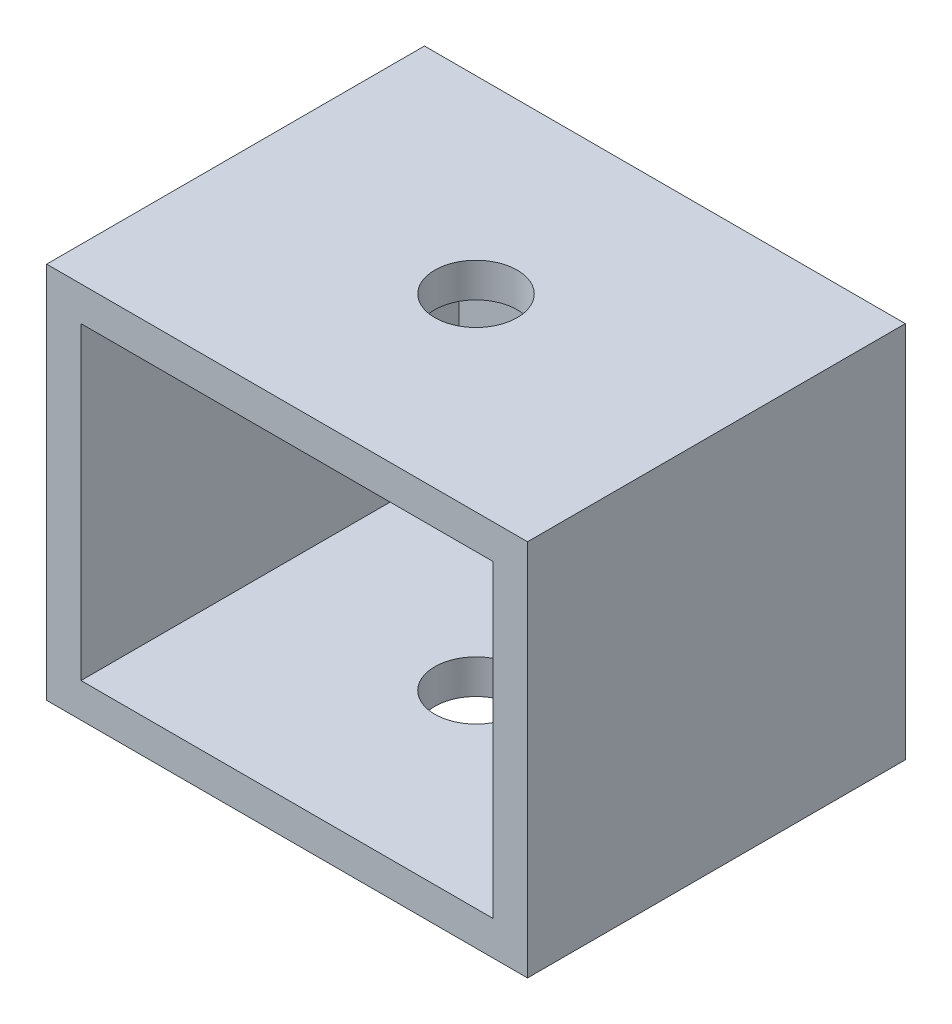
ISO-10303-21;
HEADER;
FILE_DESCRIPTION(('STEP AP214'),'2;1');
FILE_NAME('part.step','',(''),(''),'','','');
FILE_SCHEMA(('AUTOMOTIVE_DESIGN { 1 0 10303 214 1 1 1 1 }'));
ENDSEC;
DATA;
#1=APPLICATION_CONTEXT('core data for automotive mechanical design processes');
#2=APPLICATION_PROTOCOL_DEFINITION('international standard','automotive_design',2000,#1);
#3=PRODUCT_CONTEXT('',#1,'mechanical');
#4=PRODUCT('Part','Part','',(#3));
#5=PRODUCT_RELATED_PRODUCT_CATEGORY('part','',(#4));
#6=PRODUCT_DEFINITION_FORMATION('','',#4);
#7=PRODUCT_DEFINITION_CONTEXT('part definition',#1,'design');
#8=PRODUCT_DEFINITION('design','',#6,#7);
#9=PRODUCT_DEFINITION_SHAPE('','',#8);
#10=(LENGTH_UNIT() NAMED_UNIT(*) SI_UNIT(.MILLI.,.METRE.));
#11=(NAMED_UNIT(*) PLANE_ANGLE_UNIT() SI_UNIT($,.RADIAN.));
#12=(NAMED_UNIT(*) SI_UNIT($,.STERADIAN.) SOLID_ANGLE_UNIT());
#13=UNCERTAINTY_MEASURE_WITH_UNIT(LENGTH_MEASURE(1.E-05),#10,'distance_accuracy_value','');
#14=(GEOMETRIC_REPRESENTATION_CONTEXT(3) GLOBAL_UNCERTAINTY_ASSIGNED_CONTEXT((#13)) GLOBAL_UNIT_ASSIGNED_CONTEXT((#10,
#11,#12)) REPRESENTATION_CONTEXT('',''));
#15=CARTESIAN_POINT('',(0.,0.,0.));
#16=DIRECTION('',(0.,0.,1.));
#17=DIRECTION('',(1.,0.,0.));
#18=AXIS2_PLACEMENT_3D('',#15,#16,#17);
#19=CARTESIAN_POINT('',(-65.,50.,0.));
#20=DIRECTION('',(0.,1.,0.));
#21=DIRECTION('',(0.,0.,1.));
#22=AXIS2_PLACEMENT_3D('',#19,#20,#21);
#23=PLANE('',#22);
#24=CARTESIAN_POINT('',(-35.,50.,27.5));
#25=DIRECTION('',(0.,1.,0.));
#26=DIRECTION('',(0.,0.,1.));
#27=AXIS2_PLACEMENT_3D('',#24,#25,#26);
#28=CIRCLE('',#27,6.);
#29=CARTESIAN_POINT('',(-35.,50.,33.5));
#30=VERTEX_POINT('',#29);
#31=EDGE_CURVE('E177',#30,#30,#28,.T.);
#32=ORIENTED_EDGE('',*,*,#31,.T.);
#33=EDGE_LOOP('',(#32));
#34=FACE_BOUND('',#33,.T.);
#35=DIRECTION('',(0.,0.,1.));
#36=VECTOR('',#35,1.);
#37=CARTESIAN_POINT('',(-65.,50.,0.));
#38=LINE('',#37,#36);
#39=CARTESIAN_POINT('',(-65.,50.,5.));
#40=VERTEX_POINT('',#39);
#41=CARTESIAN_POINT('',(-65.,50.,55.));
#42=VERTEX_POINT('',#41);
#43=EDGE_CURVE('E144',#40,#42,#38,.T.);
#44=ORIENTED_EDGE('',*,*,#43,.F.);
#45=DIRECTION('',(-1.,0.,0.));
#46=VECTOR('',#45,1.);
#47=CARTESIAN_POINT('',(-5.,50.,5.));
#48=LINE('',#47,#46);
#49=CARTESIAN_POINT('',(-5.01959186529888,50.,5.));
#50=VERTEX_POINT('',#49);
#51=EDGE_CURVE('E11',#50,#40,#48,.T.);
#52=ORIENTED_EDGE('',*,*,#51,.F.);
#53=DIRECTION('',(0.,0.,1.));
#54=VECTOR('',#53,1.);
#55=CARTESIAN_POINT('',(-5.01959186529888,50.,0.));
#56=LINE('',#55,#54);
#57=CARTESIAN_POINT('',(-5.01959186529889,50.,0.));
#58=VERTEX_POINT('',#57);
#59=EDGE_CURVE('E141',#58,#50,#56,.T.);
#60=ORIENTED_EDGE('',*,*,#59,.F.);
#61=DIRECTION('',(-1.,0.,0.));
#62=VECTOR('',#61,1.);
#63=CARTESIAN_POINT('',(-10.0195918652989,50.,0.));
#64=LINE('',#63,#62);
#65=CARTESIAN_POINT('',(-5.,50.,0.));
#66=VERTEX_POINT('',#65);
#67=EDGE_CURVE('E235',#66,#58,#64,.T.);
#68=ORIENTED_EDGE('',*,*,#67,.F.);
#69=DIRECTION('',(0.,0.,1.));
#70=VECTOR('',#69,1.);
#71=CARTESIAN_POINT('',(-5.,50.,0.));
#72=LINE('',#71,#70);
#73=CARTESIAN_POINT('',(-5.,50.,55.));
#74=VERTEX_POINT('',#73);
#75=EDGE_CURVE('E220',#66,#74,#72,.T.);
#76=ORIENTED_EDGE('',*,*,#75,.T.);
#77=DIRECTION('',(-1.,0.,0.));
#78=VECTOR('',#77,1.);
#79=CARTESIAN_POINT('',(-5.,50.,55.));
#80=LINE('',#79,#78);
#81=EDGE_CURVE('E183',#74,#42,#80,.T.);
#82=ORIENTED_EDGE('',*,*,#81,.T.);
#83=EDGE_LOOP('',(#44,#52,#60,#68,#76,#82));
#84=FACE_BOUND('',#83,.T.);
#85=ADVANCED_FACE('F33',(#34,#84),#23,.F.);
#86=CARTESIAN_POINT('',(-65.,50.,0.));
#87=DIRECTION('',(-1.,0.,0.));
#88=DIRECTION('',(0.,0.,1.));
#89=AXIS2_PLACEMENT_3D('',#86,#87,#88);
#90=PLANE('',#89);
#91=DIRECTION('',(0.,0.,1.));
#92=VECTOR('',#91,1.);
#93=CARTESIAN_POINT('',(-65.,40.,0.));
#94=LINE('',#93,#92);
#95=CARTESIAN_POINT('',(-65.,40.,0.));
#96=VERTEX_POINT('',#95);
#97=CARTESIAN_POINT('',(-65.,40.,5.));
#98=VERTEX_POINT('',#97);
#99=EDGE_CURVE('E50',#96,#98,#94,.T.);
#100=ORIENTED_EDGE('',*,*,#99,.T.);
#101=DIRECTION('',(0.,1.,0.));
#102=VECTOR('',#101,1.);
#103=CARTESIAN_POINT('',(-65.,50.,5.));
#104=LINE('',#103,#102);
#105=EDGE_CURVE('E296',#98,#40,#104,.T.);
#106=ORIENTED_EDGE('',*,*,#105,.T.);
#107=ORIENTED_EDGE('',*,*,#43,.T.);
#108=DIRECTION('',(0.,-1.,0.));
#109=VECTOR('',#108,1.);
#110=CARTESIAN_POINT('',(-65.,5.,55.));
#111=LINE('',#110,#109);
#112=CARTESIAN_POINT('',(-65.,5.,55.));
#113=VERTEX_POINT('',#112);
#114=EDGE_CURVE('E185',#42,#113,#111,.T.);
#115=ORIENTED_EDGE('',*,*,#114,.T.);
#116=DIRECTION('',(0.,0.,1.));
#117=VECTOR('',#116,1.);
#118=CARTESIAN_POINT('',(-65.,5.,0.));
#119=LINE('',#118,#117);
#120=CARTESIAN_POINT('',(-65.,5.,0.));
#121=VERTEX_POINT('',#120);
#122=EDGE_CURVE('E218',#121,#113,#119,.T.);
#123=ORIENTED_EDGE('',*,*,#122,.F.);
#124=DIRECTION('',(0.,-1.,0.));
#125=VECTOR('',#124,1.);
#126=CARTESIAN_POINT('',(-65.,50.,0.));
#127=LINE('',#126,#125);
#128=EDGE_CURVE('E55',#96,#121,#127,.T.);
#129=ORIENTED_EDGE('',*,*,#128,.F.);
#130=EDGE_LOOP('',(#100,#106,#107,#115,#123,#129));
#131=FACE_BOUND('',#130,.T.);
#132=ADVANCED_FACE('F295',(#131),#90,.F.);
#133=CARTESIAN_POINT('',(-60.,50.,0.));
#134=DIRECTION('',(1.,0.,0.));
#135=DIRECTION('',(0.,1.,0.));
#136=AXIS2_PLACEMENT_3D('',#133,#134,#135);
#137=PLANE('',#136);
#138=DIRECTION('',(0.,0.,1.));
#139=VECTOR('',#138,1.);
#140=CARTESIAN_POINT('',(-60.,40.,0.));
#141=LINE('',#140,#139);
#142=CARTESIAN_POINT('',(-60.,40.,0.));
#143=VERTEX_POINT('',#142);
#144=CARTESIAN_POINT('',(-60.,40.,5.));
#145=VERTEX_POINT('',#144);
#146=EDGE_CURVE('E301',#143,#145,#141,.T.);
#147=ORIENTED_EDGE('',*,*,#146,.F.);
#148=DIRECTION('',(0.,1.,0.));
#149=VECTOR('',#148,1.);
#150=CARTESIAN_POINT('',(-60.,50.,0.));
#151=LINE('',#150,#149);
#152=CARTESIAN_POINT('',(-60.,5.,0.));
#153=VERTEX_POINT('',#152);
#154=EDGE_CURVE('E215',#153,#143,#151,.T.);
#155=ORIENTED_EDGE('',*,*,#154,.F.);
#156=DIRECTION('',(0.,0.,1.));
#157=VECTOR('',#156,1.);
#158=CARTESIAN_POINT('',(-60.,5.,0.));
#159=LINE('',#158,#157);
#160=CARTESIAN_POINT('',(-60.,5.,5.));
#161=VERTEX_POINT('',#160);
#162=EDGE_CURVE('E223',#153,#161,#159,.T.);
#163=ORIENTED_EDGE('',*,*,#162,.T.);
#164=DIRECTION('',(0.,1.,0.));
#165=VECTOR('',#164,1.);
#166=CARTESIAN_POINT('',(-60.,50.,5.));
#167=LINE('',#166,#165);
#168=EDGE_CURVE('E212',#161,#145,#167,.T.);
#169=ORIENTED_EDGE('',*,*,#168,.T.);
#170=EDGE_LOOP('',(#147,#155,#163,#169));
#171=FACE_BOUND('',#170,.T.);
#172=ADVANCED_FACE('F313',(#171),#137,.F.);
#173=CARTESIAN_POINT('',(-10.0195918652989,50.,0.));
#174=DIRECTION('',(-1.,0.,0.));
#175=DIRECTION('',(0.,-1.,0.));
#176=AXIS2_PLACEMENT_3D('',#173,#174,#175);
#177=PLANE('',#176);
#178=DIRECTION('',(0.,0.,-1.));
#179=VECTOR('',#178,1.);
#180=CARTESIAN_POINT('',(-10.0195918652989,40.,0.));
#181=LINE('',#180,#179);
#182=CARTESIAN_POINT('',(-10.0195918652989,40.,5.));
#183=VERTEX_POINT('',#182);
#184=CARTESIAN_POINT('',(-10.0195918652989,40.,0.));
#185=VERTEX_POINT('',#184);
#186=EDGE_CURVE('E167',#183,#185,#181,.T.);
#187=ORIENTED_EDGE('',*,*,#186,.F.);
#188=DIRECTION('',(0.,-1.,0.));
#189=VECTOR('',#188,1.);
#190=CARTESIAN_POINT('',(-10.0195918652989,50.,5.));
#191=LINE('',#190,#189);
#192=CARTESIAN_POINT('',(-10.0195918652989,5.,5.));
#193=VERTEX_POINT('',#192);
#194=EDGE_CURVE('E209',#183,#193,#191,.T.);
#195=ORIENTED_EDGE('',*,*,#194,.T.);
#196=DIRECTION('',(0.,0.,1.));
#197=VECTOR('',#196,1.);
#198=CARTESIAN_POINT('',(-10.0195918652989,5.,0.));
#199=LINE('',#198,#197);
#200=CARTESIAN_POINT('',(-10.0195918652989,5.,0.));
#201=VERTEX_POINT('',#200);
#202=EDGE_CURVE('E237',#201,#193,#199,.T.);
#203=ORIENTED_EDGE('',*,*,#202,.F.);
#204=DIRECTION('',(0.,-1.,0.));
#205=VECTOR('',#204,1.);
#206=CARTESIAN_POINT('',(-10.0195918652989,50.,0.));
#207=LINE('',#206,#205);
#208=EDGE_CURVE('E227',#185,#201,#207,.T.);
#209=ORIENTED_EDGE('',*,*,#208,.F.);
#210=EDGE_LOOP('',(#187,#195,#203,#209));
#211=FACE_BOUND('',#210,.T.);
#212=ADVANCED_FACE('F320',(#211),#177,.F.);
#213=CARTESIAN_POINT('',(0.,0.,5.));
#214=DIRECTION('',(0.,0.,1.));
#215=DIRECTION('',(1.,0.,0.));
#216=AXIS2_PLACEMENT_3D('',#213,#214,#215);
#217=PLANE('',#216);
#218=ORIENTED_EDGE('',*,*,#194,.F.);
#219=DIRECTION('',(-1.,0.,0.));
#220=VECTOR('',#219,1.);
#221=CARTESIAN_POINT('',(-5.01959186529888,40.,5.));
#222=LINE('',#221,#220);
#223=CARTESIAN_POINT('',(-5.01959186529888,40.,5.));
#224=VERTEX_POINT('',#223);
#225=EDGE_CURVE('E159',#224,#183,#222,.T.);
#226=ORIENTED_EDGE('',*,*,#225,.F.);
#227=DIRECTION('',(0.,-1.,0.));
#228=VECTOR('',#227,1.);
#229=CARTESIAN_POINT('',(-5.01959186529888,50.,5.));
#230=LINE('',#229,#228);
#231=EDGE_CURVE('E151',#50,#224,#230,.T.);
#232=ORIENTED_EDGE('',*,*,#231,.F.);
#233=ORIENTED_EDGE('',*,*,#51,.T.);
#234=ORIENTED_EDGE('',*,*,#105,.F.);
#235=DIRECTION('',(1.,0.,0.));
#236=VECTOR('',#235,1.);
#237=CARTESIAN_POINT('',(-65.,40.,5.));
#238=LINE('',#237,#236);
#239=EDGE_CURVE('E298',#98,#145,#238,.T.);
#240=ORIENTED_EDGE('',*,*,#239,.T.);
#241=ORIENTED_EDGE('',*,*,#168,.F.);
#242=DIRECTION('',(1.,0.,0.));
#243=VECTOR('',#242,1.);
#244=CARTESIAN_POINT('',(-65.,5.,5.));
#245=LINE('',#244,#243);
#246=EDGE_CURVE('E42',#161,#193,#245,.T.);
#247=ORIENTED_EDGE('',*,*,#246,.T.);
#248=EDGE_LOOP('',(#218,#226,#232,#233,#234,#240,#241,#247));
#249=FACE_BOUND('',#248,.T.);
#250=ADVANCED_FACE('F157',(#249),#217,.T.);
#251=CARTESIAN_POINT('',(0.,0.,5.));
#252=DIRECTION('',(-1.,0.,0.));
#253=DIRECTION('',(0.,-1.,0.));
#254=AXIS2_PLACEMENT_3D('',#251,#252,#253);
#255=PLANE('',#254);
#256=DIRECTION('',(0.,1.,0.));
#257=VECTOR('',#256,1.);
#258=CARTESIAN_POINT('',(0.,0.,0.));
#259=LINE('',#258,#257);
#260=CARTESIAN_POINT('',(0.,0.,0.));
#261=VERTEX_POINT('',#260);
#262=CARTESIAN_POINT('',(0.,55.,0.));
#263=VERTEX_POINT('',#262);
#264=EDGE_CURVE('E222',#261,#263,#259,.T.);
#265=ORIENTED_EDGE('',*,*,#264,.T.);
#266=DIRECTION('',(0.,0.,-1.));
#267=VECTOR('',#266,1.);
#268=CARTESIAN_POINT('',(0.,55.,5.));
#269=LINE('',#268,#267);
#270=CARTESIAN_POINT('',(0.,55.,55.));
#271=VERTEX_POINT('',#270);
#272=EDGE_CURVE('E197',#271,#263,#269,.T.);
#273=ORIENTED_EDGE('',*,*,#272,.F.);
#274=DIRECTION('',(0.,1.,0.));
#275=VECTOR('',#274,1.);
#276=CARTESIAN_POINT('',(0.,0.,55.));
#277=LINE('',#276,#275);
#278=CARTESIAN_POINT('',(0.,0.,55.));
#279=VERTEX_POINT('',#278);
#280=EDGE_CURVE('E203',#279,#271,#277,.T.);
#281=ORIENTED_EDGE('',*,*,#280,.F.);
#282=DIRECTION('',(0.,0.,-1.));
#283=VECTOR('',#282,1.);
#284=CARTESIAN_POINT('',(0.,0.,5.));
#285=LINE('',#284,#283);
#286=EDGE_CURVE('E252',#279,#261,#285,.T.);
#287=ORIENTED_EDGE('',*,*,#286,.T.);
#288=EDGE_LOOP('',(#265,#273,#281,#287));
#289=FACE_BOUND('',#288,.T.);
#290=ADVANCED_FACE('F35',(#289),#255,.F.);
#291=CARTESIAN_POINT('',(0.,55.,5.));
#292=DIRECTION('',(0.,-1.,0.));
#293=DIRECTION('',(1.,0.,0.));
#294=AXIS2_PLACEMENT_3D('',#291,#292,#293);
#295=PLANE('',#294);
#296=CARTESIAN_POINT('',(-35.,55.,27.5));
#297=DIRECTION('',(0.,1.,0.));
#298=DIRECTION('',(-1.,0.,0.));
#299=AXIS2_PLACEMENT_3D('',#296,#297,#298);
#300=CIRCLE('',#299,6.);
#301=CARTESIAN_POINT('',(-41.,55.,27.5));
#302=VERTEX_POINT('',#301);
#303=EDGE_CURVE('E174',#302,#302,#300,.T.);
#304=ORIENTED_EDGE('',*,*,#303,.F.);
#305=EDGE_LOOP('',(#304));
#306=FACE_BOUND('',#305,.T.);
#307=DIRECTION('',(-1.,0.,0.));
#308=VECTOR('',#307,1.);
#309=CARTESIAN_POINT('',(0.,55.,0.));
#310=LINE('',#309,#308);
#311=CARTESIAN_POINT('',(-70.,55.,0.));
#312=VERTEX_POINT('',#311);
#313=EDGE_CURVE('E246',#263,#312,#310,.T.);
#314=ORIENTED_EDGE('',*,*,#313,.T.);
#315=DIRECTION('',(0.,0.,-1.));
#316=VECTOR('',#315,1.);
#317=CARTESIAN_POINT('',(-70.,55.,5.));
#318=LINE('',#317,#316);
#319=CARTESIAN_POINT('',(-70.,55.,55.));
#320=VERTEX_POINT('',#319);
#321=EDGE_CURVE('E258',#320,#312,#318,.T.);
#322=ORIENTED_EDGE('',*,*,#321,.F.);
#323=DIRECTION('',(-1.,0.,0.));
#324=VECTOR('',#323,1.);
#325=CARTESIAN_POINT('',(0.,55.,55.));
#326=LINE('',#325,#324);
#327=EDGE_CURVE('E206',#271,#320,#326,.T.);
#328=ORIENTED_EDGE('',*,*,#327,.F.);
#329=ORIENTED_EDGE('',*,*,#272,.T.);
#330=EDGE_LOOP('',(#314,#322,#328,#329));
#331=FACE_BOUND('',#330,.T.);
#332=ADVANCED_FACE('F263',(#306,#331),#295,.F.);
#333=CARTESIAN_POINT('',(-70.,0.,5.));
#334=DIRECTION('',(1.,0.,0.));
#335=DIRECTION('',(0.,0.,-1.));
#336=AXIS2_PLACEMENT_3D('',#333,#334,#335);
#337=PLANE('',#336);
#338=DIRECTION('',(0.,-1.,0.));
#339=VECTOR('',#338,1.);
#340=CARTESIAN_POINT('',(-70.,0.,0.));
#341=LINE('',#340,#339);
#342=CARTESIAN_POINT('',(-70.,0.,0.));
#343=VERTEX_POINT('',#342);
#344=EDGE_CURVE('E248',#312,#343,#341,.T.);
#345=ORIENTED_EDGE('',*,*,#344,.T.);
#346=DIRECTION('',(0.,0.,-1.));
#347=VECTOR('',#346,1.);
#348=CARTESIAN_POINT('',(-70.,0.,5.));
#349=LINE('',#348,#347);
#350=CARTESIAN_POINT('',(-70.,0.,55.));
#351=VERTEX_POINT('',#350);
#352=EDGE_CURVE('E255',#351,#343,#349,.T.);
#353=ORIENTED_EDGE('',*,*,#352,.F.);
#354=DIRECTION('',(0.,-1.,0.));
#355=VECTOR('',#354,1.);
#356=CARTESIAN_POINT('',(-70.,0.,55.));
#357=LINE('',#356,#355);
#358=EDGE_CURVE('E193',#320,#351,#357,.T.);
#359=ORIENTED_EDGE('',*,*,#358,.F.);
#360=ORIENTED_EDGE('',*,*,#321,.T.);
#361=EDGE_LOOP('',(#345,#353,#359,#360));
#362=FACE_BOUND('',#361,.T.);
#363=ADVANCED_FACE('F272',(#362),#337,.F.);
#364=CARTESIAN_POINT('',(0.,0.,5.));
#365=DIRECTION('',(0.,1.,0.));
#366=DIRECTION('',(0.,0.,1.));
#367=AXIS2_PLACEMENT_3D('',#364,#365,#366);
#368=PLANE('',#367);
#369=CARTESIAN_POINT('',(-35.,0.,27.5));
#370=DIRECTION('',(0.,1.,0.));
#371=DIRECTION('',(0.,0.,1.));
#372=AXIS2_PLACEMENT_3D('',#369,#370,#371);
#373=CIRCLE('',#372,6.);
#374=CARTESIAN_POINT('',(-35.,0.,33.5));
#375=VERTEX_POINT('',#374);
#376=EDGE_CURVE('E180',#375,#375,#373,.T.);
#377=ORIENTED_EDGE('',*,*,#376,.T.);
#378=EDGE_LOOP('',(#377));
#379=FACE_BOUND('',#378,.T.);
#380=DIRECTION('',(1.,0.,0.));
#381=VECTOR('',#380,1.);
#382=CARTESIAN_POINT('',(0.,0.,0.));
#383=LINE('',#382,#381);
#384=EDGE_CURVE('E250',#343,#261,#383,.T.);
#385=ORIENTED_EDGE('',*,*,#384,.T.);
#386=ORIENTED_EDGE('',*,*,#286,.F.);
#387=DIRECTION('',(1.,0.,0.));
#388=VECTOR('',#387,1.);
#389=CARTESIAN_POINT('',(-70.,0.,55.));
#390=LINE('',#389,#388);
#391=EDGE_CURVE('E200',#351,#279,#390,.T.);
#392=ORIENTED_EDGE('',*,*,#391,.F.);
#393=ORIENTED_EDGE('',*,*,#352,.T.);
#394=EDGE_LOOP('',(#385,#386,#392,#393));
#395=FACE_BOUND('',#394,.T.);
#396=ADVANCED_FACE('F276',(#379,#395),#368,.F.);
#397=CARTESIAN_POINT('',(0.,0.,0.));
#398=DIRECTION('',(0.,0.,1.));
#399=DIRECTION('',(1.,0.,0.));
#400=AXIS2_PLACEMENT_3D('',#397,#398,#399);
#401=PLANE('',#400);
#402=DIRECTION('',(1.,0.,0.));
#403=VECTOR('',#402,1.);
#404=CARTESIAN_POINT('',(-65.,40.,0.));
#405=LINE('',#404,#403);
#406=EDGE_CURVE('E170',#96,#143,#405,.T.);
#407=ORIENTED_EDGE('',*,*,#406,.F.);
#408=ORIENTED_EDGE('',*,*,#128,.T.);
#409=DIRECTION('',(1.,0.,0.));
#410=VECTOR('',#409,1.);
#411=CARTESIAN_POINT('',(-65.,5.,0.));
#412=LINE('',#411,#410);
#413=EDGE_CURVE('E211',#121,#153,#412,.T.);
#414=ORIENTED_EDGE('',*,*,#413,.T.);
#415=ORIENTED_EDGE('',*,*,#154,.T.);
#416=EDGE_LOOP('',(#407,#408,#414,#415));
#417=FACE_BOUND('',#416,.T.);
#418=DIRECTION('',(-1.,0.,0.));
#419=VECTOR('',#418,1.);
#420=CARTESIAN_POINT('',(-5.01959186529888,40.,0.));
#421=LINE('',#420,#419);
#422=CARTESIAN_POINT('',(-5.01959186529888,40.,0.));
#423=VERTEX_POINT('',#422);
#424=EDGE_CURVE('E163',#423,#185,#421,.T.);
#425=ORIENTED_EDGE('',*,*,#424,.T.);
#426=ORIENTED_EDGE('',*,*,#208,.T.);
#427=DIRECTION('',(1.,0.,0.));
#428=VECTOR('',#427,1.);
#429=CARTESIAN_POINT('',(-10.0195918652989,5.,0.));
#430=LINE('',#429,#428);
#431=CARTESIAN_POINT('',(-4.99999999999999,5.,0.));
#432=VERTEX_POINT('',#431);
#433=EDGE_CURVE('E229',#201,#432,#430,.T.);
#434=ORIENTED_EDGE('',*,*,#433,.T.);
#435=DIRECTION('',(0.,1.,0.));
#436=VECTOR('',#435,1.);
#437=CARTESIAN_POINT('',(-5.,50.,0.));
#438=LINE('',#437,#436);
#439=EDGE_CURVE('E232',#432,#66,#438,.T.);
#440=ORIENTED_EDGE('',*,*,#439,.T.);
#441=ORIENTED_EDGE('',*,*,#67,.T.);
#442=DIRECTION('',(0.,1.,0.));
#443=VECTOR('',#442,1.);
#444=CARTESIAN_POINT('',(-5.01959186529888,50.,0.));
#445=LINE('',#444,#443);
#446=EDGE_CURVE('E154',#423,#58,#445,.T.);
#447=ORIENTED_EDGE('',*,*,#446,.F.);
#448=EDGE_LOOP('',(#425,#426,#434,#440,#441,#447));
#449=FACE_BOUND('',#448,.T.);
#450=ORIENTED_EDGE('',*,*,#264,.F.);
#451=ORIENTED_EDGE('',*,*,#384,.F.);
#452=ORIENTED_EDGE('',*,*,#344,.F.);
#453=ORIENTED_EDGE('',*,*,#313,.F.);
#454=EDGE_LOOP('',(#450,#451,#452,#453));
#455=FACE_BOUND('',#454,.T.);
#456=ADVANCED_FACE('F269',(#417,#449,#455),#401,.F.);
#457=CARTESIAN_POINT('',(-5.,50.,0.));
#458=DIRECTION('',(1.,0.,0.));
#459=DIRECTION('',(0.,1.,0.));
#460=AXIS2_PLACEMENT_3D('',#457,#458,#459);
#461=PLANE('',#460);
#462=DIRECTION('',(0.,0.,1.));
#463=VECTOR('',#462,1.);
#464=CARTESIAN_POINT('',(-4.99999999999999,5.,0.));
#465=LINE('',#464,#463);
#466=CARTESIAN_POINT('',(-5.,5.,55.));
#467=VERTEX_POINT('',#466);
#468=EDGE_CURVE('E240',#432,#467,#465,.T.);
#469=ORIENTED_EDGE('',*,*,#468,.T.);
#470=DIRECTION('',(0.,1.,0.));
#471=VECTOR('',#470,1.);
#472=CARTESIAN_POINT('',(-5.,5.,55.));
#473=LINE('',#472,#471);
#474=EDGE_CURVE('E191',#467,#74,#473,.T.);
#475=ORIENTED_EDGE('',*,*,#474,.T.);
#476=ORIENTED_EDGE('',*,*,#75,.F.);
#477=ORIENTED_EDGE('',*,*,#439,.F.);
#478=EDGE_LOOP('',(#469,#475,#476,#477));
#479=FACE_BOUND('',#478,.T.);
#480=ADVANCED_FACE('F289',(#479),#461,.F.);
#481=CARTESIAN_POINT('',(-65.,5.,0.));
#482=DIRECTION('',(0.,-1.,0.));
#483=DIRECTION('',(0.,0.,-1.));
#484=AXIS2_PLACEMENT_3D('',#481,#482,#483);
#485=PLANE('',#484);
#486=CARTESIAN_POINT('',(-35.,5.,27.5));
#487=DIRECTION('',(0.,-1.,0.));
#488=DIRECTION('',(0.,0.,-1.));
#489=AXIS2_PLACEMENT_3D('',#486,#487,#488);
#490=CIRCLE('',#489,6.);
#491=CARTESIAN_POINT('',(-35.,5.,21.5));
#492=VERTEX_POINT('',#491);
#493=EDGE_CURVE('E37',#492,#492,#490,.T.);
#494=ORIENTED_EDGE('',*,*,#493,.T.);
#495=EDGE_LOOP('',(#494));
#496=FACE_BOUND('',#495,.T.);
#497=ORIENTED_EDGE('',*,*,#122,.T.);
#498=DIRECTION('',(1.,0.,0.));
#499=VECTOR('',#498,1.);
#500=CARTESIAN_POINT('',(-65.,5.,55.));
#501=LINE('',#500,#499);
#502=EDGE_CURVE('E188',#113,#467,#501,.T.);
#503=ORIENTED_EDGE('',*,*,#502,.T.);
#504=ORIENTED_EDGE('',*,*,#468,.F.);
#505=ORIENTED_EDGE('',*,*,#433,.F.);
#506=ORIENTED_EDGE('',*,*,#202,.T.);
#507=ORIENTED_EDGE('',*,*,#246,.F.);
#508=ORIENTED_EDGE('',*,*,#162,.F.);
#509=ORIENTED_EDGE('',*,*,#413,.F.);
#510=EDGE_LOOP('',(#497,#503,#504,#505,#506,#507,#508,#509));
#511=FACE_BOUND('',#510,.T.);
#512=ADVANCED_FACE('F282',(#496,#511),#485,.F.);
#513=CARTESIAN_POINT('',(0.,0.,55.));
#514=DIRECTION('',(0.,0.,-1.));
#515=DIRECTION('',(-1.,0.,0.));
#516=AXIS2_PLACEMENT_3D('',#513,#514,#515);
#517=PLANE('',#516);
#518=ORIENTED_EDGE('',*,*,#358,.T.);
#519=ORIENTED_EDGE('',*,*,#391,.T.);
#520=ORIENTED_EDGE('',*,*,#280,.T.);
#521=ORIENTED_EDGE('',*,*,#327,.T.);
#522=EDGE_LOOP('',(#518,#519,#520,#521));
#523=FACE_BOUND('',#522,.T.);
#524=ORIENTED_EDGE('',*,*,#81,.F.);
#525=ORIENTED_EDGE('',*,*,#474,.F.);
#526=ORIENTED_EDGE('',*,*,#502,.F.);
#527=ORIENTED_EDGE('',*,*,#114,.F.);
#528=EDGE_LOOP('',(#524,#525,#526,#527));
#529=FACE_BOUND('',#528,.T.);
#530=ADVANCED_FACE('F278',(#523,#529),#517,.F.);
#531=CARTESIAN_POINT('',(-35.,-15.,27.5));
#532=DIRECTION('',(0.,1.,0.));
#533=DIRECTION('',(-1.,0.,0.));
#534=AXIS2_PLACEMENT_3D('',#531,#532,#533);
#535=CYLINDRICAL_SURFACE('',#534,6.);
#536=ORIENTED_EDGE('',*,*,#493,.F.);
#537=EDGE_LOOP('',(#536));
#538=FACE_BOUND('',#537,.T.);
#539=ORIENTED_EDGE('',*,*,#376,.F.);
#540=EDGE_LOOP('',(#539));
#541=FACE_BOUND('',#540,.T.);
#542=ADVANCED_FACE('F281',(#538,#541),#535,.F.);
#543=ORIENTED_EDGE('',*,*,#303,.T.);
#544=EDGE_LOOP('',(#543));
#545=FACE_BOUND('',#544,.T.);
#546=ORIENTED_EDGE('',*,*,#31,.F.);
#547=EDGE_LOOP('',(#546));
#548=FACE_BOUND('',#547,.T.);
#549=ADVANCED_FACE('F364',(#545,#548),#535,.F.);
#550=CARTESIAN_POINT('',(-5.01959186529888,40.,0.));
#551=DIRECTION('',(0.,1.,0.));
#552=DIRECTION('',(-1.,0.,0.));
#553=AXIS2_PLACEMENT_3D('',#550,#551,#552);
#554=PLANE('',#553);
#555=ORIENTED_EDGE('',*,*,#186,.T.);
#556=ORIENTED_EDGE('',*,*,#424,.F.);
#557=DIRECTION('',(0.,0.,-1.));
#558=VECTOR('',#557,1.);
#559=CARTESIAN_POINT('',(-5.01959186529888,40.,0.));
#560=LINE('',#559,#558);
#561=EDGE_CURVE('E161',#224,#423,#560,.T.);
#562=ORIENTED_EDGE('',*,*,#561,.F.);
#563=ORIENTED_EDGE('',*,*,#225,.T.);
#564=EDGE_LOOP('',(#555,#556,#562,#563));
#565=FACE_BOUND('',#564,.T.);
#566=ADVANCED_FACE('F318',(#565),#554,.F.);
#567=CARTESIAN_POINT('',(-5.01959186529887,0.,0.));
#568=DIRECTION('',(-1.,0.,0.));
#569=DIRECTION('',(0.,-1.,0.));
#570=AXIS2_PLACEMENT_3D('',#567,#568,#569);
#571=PLANE('',#570);
#572=ORIENTED_EDGE('',*,*,#446,.T.);
#573=ORIENTED_EDGE('',*,*,#59,.T.);
#574=ORIENTED_EDGE('',*,*,#231,.T.);
#575=ORIENTED_EDGE('',*,*,#561,.T.);
#576=EDGE_LOOP('',(#572,#573,#574,#575));
#577=FACE_BOUND('',#576,.T.);
#578=ADVANCED_FACE('F150',(#577),#571,.F.);
#579=CARTESIAN_POINT('',(-65.,40.,0.));
#580=DIRECTION('',(0.,1.,0.));
#581=DIRECTION('',(-1.,0.,0.));
#582=AXIS2_PLACEMENT_3D('',#579,#580,#581);
#583=PLANE('',#582);
#584=ORIENTED_EDGE('',*,*,#146,.T.);
#585=ORIENTED_EDGE('',*,*,#239,.F.);
#586=ORIENTED_EDGE('',*,*,#99,.F.);
#587=ORIENTED_EDGE('',*,*,#406,.T.);
#588=EDGE_LOOP('',(#584,#585,#586,#587));
#589=FACE_BOUND('',#588,.T.);
#590=ADVANCED_FACE('F309',(#589),#583,.F.);
#591=CLOSED_SHELL('',(#85,#132,#172,#212,#250,#290,#332,#363,#396,#456,#480,#512,#530,#542,#549,
#566,#578,#590));
#592=MANIFOLD_SOLID_BREP('B2',#591);
#593=ADVANCED_BREP_SHAPE_REPRESENTATION('',(#18,#592),#14);
#594=SHAPE_DEFINITION_REPRESENTATION(#9,#593);
ENDSEC;
END-ISO-10303-21;
